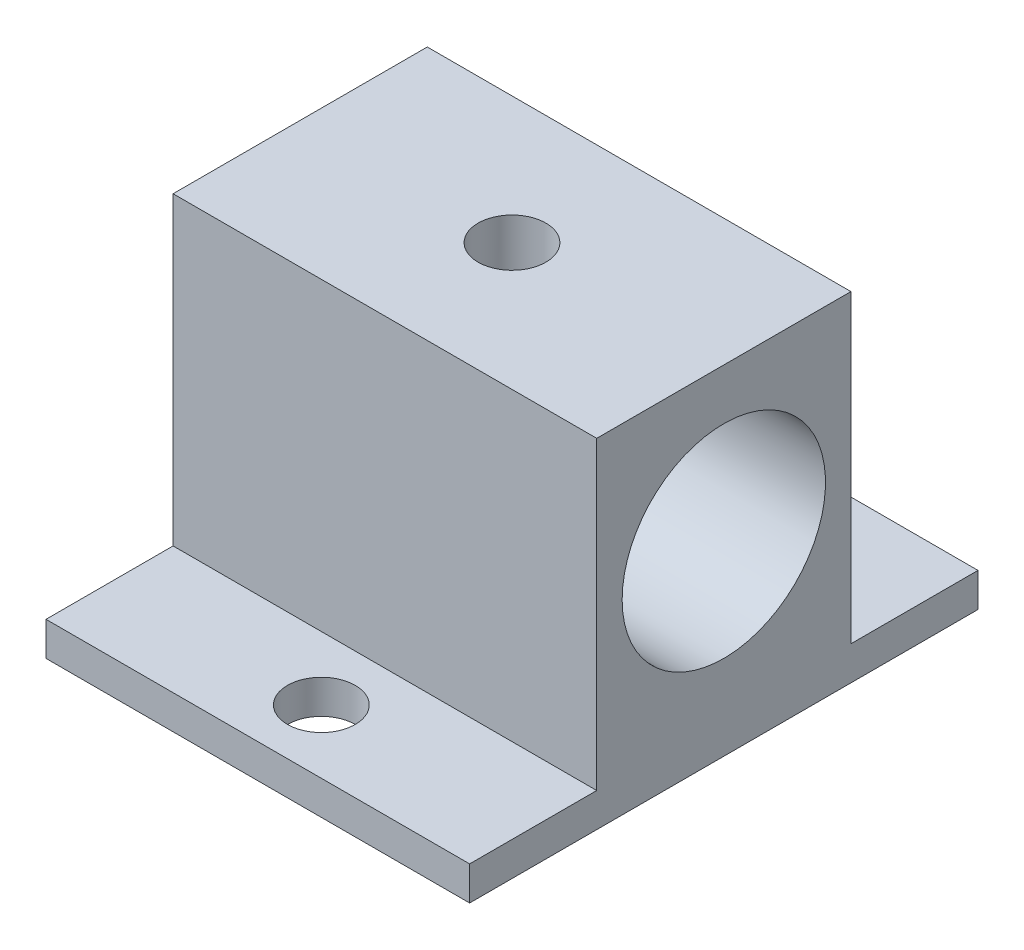
ISO-10303-21;
HEADER;
FILE_DESCRIPTION(('STEP AP214'),'2;1');
FILE_NAME('part.step','',(''),(''),'','','');
FILE_SCHEMA(('AUTOMOTIVE_DESIGN { 1 0 10303 214 1 1 1 1 }'));
ENDSEC;
DATA;
#1=APPLICATION_CONTEXT('core data for automotive mechanical design processes');
#2=APPLICATION_PROTOCOL_DEFINITION('international standard','automotive_design',2000,#1);
#3=PRODUCT_CONTEXT('',#1,'mechanical');
#4=PRODUCT('Part','Part','',(#3));
#5=PRODUCT_RELATED_PRODUCT_CATEGORY('part','',(#4));
#6=PRODUCT_DEFINITION_FORMATION('','',#4);
#7=PRODUCT_DEFINITION_CONTEXT('part definition',#1,'design');
#8=PRODUCT_DEFINITION('design','',#6,#7);
#9=PRODUCT_DEFINITION_SHAPE('','',#8);
#10=(LENGTH_UNIT() NAMED_UNIT(*) SI_UNIT(.MILLI.,.METRE.));
#11=(NAMED_UNIT(*) PLANE_ANGLE_UNIT() SI_UNIT($,.RADIAN.));
#12=(NAMED_UNIT(*) SI_UNIT($,.STERADIAN.) SOLID_ANGLE_UNIT());
#13=UNCERTAINTY_MEASURE_WITH_UNIT(LENGTH_MEASURE(1.E-05),#10,'distance_accuracy_value','');
#14=(GEOMETRIC_REPRESENTATION_CONTEXT(3) GLOBAL_UNCERTAINTY_ASSIGNED_CONTEXT((#13)) GLOBAL_UNIT_ASSIGNED_CONTEXT((#10,
#11,#12)) REPRESENTATION_CONTEXT('',''));
#15=CARTESIAN_POINT('',(0.,0.,0.));
#16=DIRECTION('',(0.,0.,1.));
#17=DIRECTION('',(1.,0.,0.));
#18=AXIS2_PLACEMENT_3D('',#15,#16,#17);
#19=CARTESIAN_POINT('',(0.,2.,0.));
#20=DIRECTION('',(0.,-1.,0.));
#21=DIRECTION('',(0.,0.,-1.));
#22=AXIS2_PLACEMENT_3D('',#19,#20,#21);
#23=PLANE('',#22);
#24=CARTESIAN_POINT('',(0.,2.,11.25));
#25=DIRECTION('',(0.,1.,0.));
#26=DIRECTION('',(0.,0.,-1.));
#27=AXIS2_PLACEMENT_3D('',#24,#25,#26);
#28=CIRCLE('',#27,2.);
#29=CARTESIAN_POINT('',(0.,2.,9.25));
#30=VERTEX_POINT('',#29);
#31=EDGE_CURVE('E210',#30,#30,#28,.T.);
#32=ORIENTED_EDGE('',*,*,#31,.F.);
#33=EDGE_LOOP('',(#32));
#34=FACE_BOUND('',#33,.T.);
#35=DIRECTION('',(1.,0.,0.));
#36=VECTOR('',#35,1.);
#37=CARTESIAN_POINT('',(-12.5,2.,7.5));
#38=LINE('',#37,#36);
#39=CARTESIAN_POINT('',(-12.5,2.,7.5));
#40=VERTEX_POINT('',#39);
#41=CARTESIAN_POINT('',(12.5,2.,7.5));
#42=VERTEX_POINT('',#41);
#43=EDGE_CURVE('E53',#40,#42,#38,.T.);
#44=ORIENTED_EDGE('',*,*,#43,.F.);
#45=DIRECTION('',(0.,0.,1.));
#46=VECTOR('',#45,1.);
#47=CARTESIAN_POINT('',(-12.5,2.,15.));
#48=LINE('',#47,#46);
#49=CARTESIAN_POINT('',(-12.5,2.,15.));
#50=VERTEX_POINT('',#49);
#51=EDGE_CURVE('E174',#40,#50,#48,.T.);
#52=ORIENTED_EDGE('',*,*,#51,.T.);
#53=DIRECTION('',(1.,0.,0.));
#54=VECTOR('',#53,1.);
#55=CARTESIAN_POINT('',(-12.5,2.,15.));
#56=LINE('',#55,#54);
#57=CARTESIAN_POINT('',(12.5,2.,15.));
#58=VERTEX_POINT('',#57);
#59=EDGE_CURVE('E164',#50,#58,#56,.T.);
#60=ORIENTED_EDGE('',*,*,#59,.T.);
#61=DIRECTION('',(0.,0.,-1.));
#62=VECTOR('',#61,1.);
#63=CARTESIAN_POINT('',(12.5,2.,15.));
#64=LINE('',#63,#62);
#65=EDGE_CURVE('E154',#58,#42,#64,.T.);
#66=ORIENTED_EDGE('',*,*,#65,.T.);
#67=EDGE_LOOP('',(#44,#52,#60,#66));
#68=FACE_BOUND('',#67,.T.);
#69=ADVANCED_FACE('F32',(#34,#68),#23,.F.);
#70=CARTESIAN_POINT('',(0.,2.,-11.25));
#71=DIRECTION('',(0.,1.,0.));
#72=DIRECTION('',(0.,0.,1.));
#73=AXIS2_PLACEMENT_3D('',#70,#71,#72);
#74=CIRCLE('',#73,1.99999999999999);
#75=CARTESIAN_POINT('',(0.,2.,-9.25000000000001));
#76=VERTEX_POINT('',#75);
#77=EDGE_CURVE('E204',#76,#76,#74,.T.);
#78=ORIENTED_EDGE('',*,*,#77,.F.);
#79=EDGE_LOOP('',(#78));
#80=FACE_BOUND('',#79,.T.);
#81=DIRECTION('',(-1.,0.,0.));
#82=VECTOR('',#81,1.);
#83=CARTESIAN_POINT('',(-12.5,2.,-7.5));
#84=LINE('',#83,#82);
#85=CARTESIAN_POINT('',(12.5,2.,-7.5));
#86=VERTEX_POINT('',#85);
#87=CARTESIAN_POINT('',(-12.5,2.,-7.5));
#88=VERTEX_POINT('',#87);
#89=EDGE_CURVE('E61',#86,#88,#84,.T.);
#90=ORIENTED_EDGE('',*,*,#89,.F.);
#91=CARTESIAN_POINT('',(12.5,2.,-15.));
#92=VERTEX_POINT('',#91);
#93=EDGE_CURVE('E125',#86,#92,#64,.T.);
#94=ORIENTED_EDGE('',*,*,#93,.T.);
#95=DIRECTION('',(-1.,0.,0.));
#96=VECTOR('',#95,1.);
#97=CARTESIAN_POINT('',(-12.5,2.,-15.));
#98=LINE('',#97,#96);
#99=CARTESIAN_POINT('',(-12.5,2.,-15.));
#100=VERTEX_POINT('',#99);
#101=EDGE_CURVE('E148',#92,#100,#98,.T.);
#102=ORIENTED_EDGE('',*,*,#101,.T.);
#103=EDGE_CURVE('E170',#100,#88,#48,.T.);
#104=ORIENTED_EDGE('',*,*,#103,.T.);
#105=EDGE_LOOP('',(#90,#94,#102,#104));
#106=FACE_BOUND('',#105,.T.);
#107=ADVANCED_FACE('F180',(#80,#106),#23,.F.);
#108=CARTESIAN_POINT('',(12.5,2.,15.));
#109=DIRECTION('',(-1.,0.,0.));
#110=DIRECTION('',(0.,0.,1.));
#111=AXIS2_PLACEMENT_3D('',#108,#109,#110);
#112=PLANE('',#111);
#113=CARTESIAN_POINT('',(12.5,11.,0.));
#114=DIRECTION('',(-1.,0.,0.));
#115=DIRECTION('',(0.,0.,1.));
#116=AXIS2_PLACEMENT_3D('',#113,#114,#115);
#117=CIRCLE('',#116,6.);
#118=CARTESIAN_POINT('',(12.5,11.,6.));
#119=VERTEX_POINT('',#118);
#120=EDGE_CURVE('E190',#119,#119,#117,.T.);
#121=ORIENTED_EDGE('',*,*,#120,.T.);
#122=EDGE_LOOP('',(#121));
#123=FACE_BOUND('',#122,.T.);
#124=DIRECTION('',(0.,0.,-1.));
#125=VECTOR('',#124,1.);
#126=CARTESIAN_POINT('',(12.5,0.,15.));
#127=LINE('',#126,#125);
#128=CARTESIAN_POINT('',(12.5,0.,15.));
#129=VERTEX_POINT('',#128);
#130=CARTESIAN_POINT('',(12.5,0.,-15.));
#131=VERTEX_POINT('',#130);
#132=EDGE_CURVE('E126',#129,#131,#127,.T.);
#133=ORIENTED_EDGE('',*,*,#132,.T.);
#134=DIRECTION('',(0.,-1.,0.));
#135=VECTOR('',#134,1.);
#136=CARTESIAN_POINT('',(12.5,2.,-15.));
#137=LINE('',#136,#135);
#138=EDGE_CURVE('E11',#92,#131,#137,.T.);
#139=ORIENTED_EDGE('',*,*,#138,.F.);
#140=ORIENTED_EDGE('',*,*,#93,.F.);
#141=DIRECTION('',(0.,-1.,0.));
#142=VECTOR('',#141,1.);
#143=CARTESIAN_POINT('',(12.5,20.,-7.5));
#144=LINE('',#143,#142);
#145=CARTESIAN_POINT('',(12.5,20.,-7.5));
#146=VERTEX_POINT('',#145);
#147=EDGE_CURVE('E107',#146,#86,#144,.T.);
#148=ORIENTED_EDGE('',*,*,#147,.F.);
#149=DIRECTION('',(0.,0.,-1.));
#150=VECTOR('',#149,1.);
#151=CARTESIAN_POINT('',(12.5,20.,-7.5));
#152=LINE('',#151,#150);
#153=CARTESIAN_POINT('',(12.5,20.,7.5));
#154=VERTEX_POINT('',#153);
#155=EDGE_CURVE('E113',#154,#146,#152,.T.);
#156=ORIENTED_EDGE('',*,*,#155,.F.);
#157=DIRECTION('',(0.,-1.,0.));
#158=VECTOR('',#157,1.);
#159=CARTESIAN_POINT('',(12.5,20.,7.5));
#160=LINE('',#159,#158);
#161=EDGE_CURVE('E139',#154,#42,#160,.T.);
#162=ORIENTED_EDGE('',*,*,#161,.T.);
#163=ORIENTED_EDGE('',*,*,#65,.F.);
#164=DIRECTION('',(0.,-1.,0.));
#165=VECTOR('',#164,1.);
#166=CARTESIAN_POINT('',(12.5,2.,15.));
#167=LINE('',#166,#165);
#168=EDGE_CURVE('E161',#58,#129,#167,.T.);
#169=ORIENTED_EDGE('',*,*,#168,.T.);
#170=EDGE_LOOP('',(#133,#139,#140,#148,#156,#162,#163,#169));
#171=FACE_BOUND('',#170,.T.);
#172=ADVANCED_FACE('F34',(#123,#171),#112,.F.);
#173=CARTESIAN_POINT('',(-12.5,2.,-15.));
#174=DIRECTION('',(0.,0.,1.));
#175=DIRECTION('',(1.,0.,0.));
#176=AXIS2_PLACEMENT_3D('',#173,#174,#175);
#177=PLANE('',#176);
#178=DIRECTION('',(-1.,0.,0.));
#179=VECTOR('',#178,1.);
#180=CARTESIAN_POINT('',(-12.5,0.,-15.));
#181=LINE('',#180,#179);
#182=CARTESIAN_POINT('',(-12.5,0.,-15.));
#183=VERTEX_POINT('',#182);
#184=EDGE_CURVE('E128',#131,#183,#181,.T.);
#185=ORIENTED_EDGE('',*,*,#184,.T.);
#186=DIRECTION('',(0.,-1.,0.));
#187=VECTOR('',#186,1.);
#188=CARTESIAN_POINT('',(-12.5,2.,-15.));
#189=LINE('',#188,#187);
#190=EDGE_CURVE('E45',#100,#183,#189,.T.);
#191=ORIENTED_EDGE('',*,*,#190,.F.);
#192=ORIENTED_EDGE('',*,*,#101,.F.);
#193=ORIENTED_EDGE('',*,*,#138,.T.);
#194=EDGE_LOOP('',(#185,#191,#192,#193));
#195=FACE_BOUND('',#194,.T.);
#196=ADVANCED_FACE('F182',(#195),#177,.F.);
#197=CARTESIAN_POINT('',(-12.5,2.,15.));
#198=DIRECTION('',(1.,0.,0.));
#199=DIRECTION('',(0.,0.,-1.));
#200=AXIS2_PLACEMENT_3D('',#197,#198,#199);
#201=PLANE('',#200);
#202=CARTESIAN_POINT('',(-12.5,11.,0.));
#203=DIRECTION('',(-1.,0.,0.));
#204=DIRECTION('',(0.,0.,1.));
#205=AXIS2_PLACEMENT_3D('',#202,#203,#204);
#206=CIRCLE('',#205,6.);
#207=CARTESIAN_POINT('',(-12.5,11.,6.));
#208=VERTEX_POINT('',#207);
#209=EDGE_CURVE('E193',#208,#208,#206,.T.);
#210=ORIENTED_EDGE('',*,*,#209,.F.);
#211=EDGE_LOOP('',(#210));
#212=FACE_BOUND('',#211,.T.);
#213=DIRECTION('',(0.,0.,1.));
#214=VECTOR('',#213,1.);
#215=CARTESIAN_POINT('',(-12.5,0.,15.));
#216=LINE('',#215,#214);
#217=CARTESIAN_POINT('',(-12.5,0.,15.));
#218=VERTEX_POINT('',#217);
#219=EDGE_CURVE('E167',#183,#218,#216,.T.);
#220=ORIENTED_EDGE('',*,*,#219,.T.);
#221=DIRECTION('',(0.,-1.,0.));
#222=VECTOR('',#221,1.);
#223=CARTESIAN_POINT('',(-12.5,2.,15.));
#224=LINE('',#223,#222);
#225=EDGE_CURVE('E158',#50,#218,#224,.T.);
#226=ORIENTED_EDGE('',*,*,#225,.F.);
#227=ORIENTED_EDGE('',*,*,#51,.F.);
#228=DIRECTION('',(0.,-1.,0.));
#229=VECTOR('',#228,1.);
#230=CARTESIAN_POINT('',(-12.5,20.,7.5));
#231=LINE('',#230,#229);
#232=CARTESIAN_POINT('',(-12.5,20.,7.5));
#233=VERTEX_POINT('',#232);
#234=EDGE_CURVE('E130',#233,#40,#231,.T.);
#235=ORIENTED_EDGE('',*,*,#234,.F.);
#236=DIRECTION('',(0.,0.,1.));
#237=VECTOR('',#236,1.);
#238=CARTESIAN_POINT('',(-12.5,20.,-7.5));
#239=LINE('',#238,#237);
#240=CARTESIAN_POINT('',(-12.5,20.,-7.5));
#241=VERTEX_POINT('',#240);
#242=EDGE_CURVE('E112',#241,#233,#239,.T.);
#243=ORIENTED_EDGE('',*,*,#242,.F.);
#244=DIRECTION('',(0.,-1.,0.));
#245=VECTOR('',#244,1.);
#246=CARTESIAN_POINT('',(-12.5,20.,-7.5));
#247=LINE('',#246,#245);
#248=EDGE_CURVE('E109',#241,#88,#247,.T.);
#249=ORIENTED_EDGE('',*,*,#248,.T.);
#250=ORIENTED_EDGE('',*,*,#103,.F.);
#251=ORIENTED_EDGE('',*,*,#190,.T.);
#252=EDGE_LOOP('',(#220,#226,#227,#235,#243,#249,#250,#251));
#253=FACE_BOUND('',#252,.T.);
#254=ADVANCED_FACE('F185',(#212,#253),#201,.F.);
#255=CARTESIAN_POINT('',(-12.5,2.,15.));
#256=DIRECTION('',(0.,0.,-1.));
#257=DIRECTION('',(-1.,0.,0.));
#258=AXIS2_PLACEMENT_3D('',#255,#256,#257);
#259=PLANE('',#258);
#260=DIRECTION('',(1.,0.,0.));
#261=VECTOR('',#260,1.);
#262=CARTESIAN_POINT('',(-12.5,0.,15.));
#263=LINE('',#262,#261);
#264=EDGE_CURVE('E165',#218,#129,#263,.T.);
#265=ORIENTED_EDGE('',*,*,#264,.T.);
#266=ORIENTED_EDGE('',*,*,#168,.F.);
#267=ORIENTED_EDGE('',*,*,#59,.F.);
#268=ORIENTED_EDGE('',*,*,#225,.T.);
#269=EDGE_LOOP('',(#265,#266,#267,#268));
#270=FACE_BOUND('',#269,.T.);
#271=ADVANCED_FACE('F237',(#270),#259,.F.);
#272=CARTESIAN_POINT('',(0.,0.,0.));
#273=DIRECTION('',(0.,-1.,0.));
#274=DIRECTION('',(0.,0.,-1.));
#275=AXIS2_PLACEMENT_3D('',#272,#273,#274);
#276=PLANE('',#275);
#277=CARTESIAN_POINT('',(0.,0.,11.25));
#278=DIRECTION('',(0.,1.,0.));
#279=DIRECTION('',(0.,0.,-1.));
#280=AXIS2_PLACEMENT_3D('',#277,#278,#279);
#281=CIRCLE('',#280,2.);
#282=CARTESIAN_POINT('',(0.,0.,9.25));
#283=VERTEX_POINT('',#282);
#284=EDGE_CURVE('E207',#283,#283,#281,.T.);
#285=ORIENTED_EDGE('',*,*,#284,.T.);
#286=EDGE_LOOP('',(#285));
#287=FACE_BOUND('',#286,.T.);
#288=CARTESIAN_POINT('',(0.,0.,-11.25));
#289=DIRECTION('',(0.,1.,0.));
#290=DIRECTION('',(0.,0.,1.));
#291=AXIS2_PLACEMENT_3D('',#288,#289,#290);
#292=CIRCLE('',#291,1.99999999999999);
#293=CARTESIAN_POINT('',(0.,0.,-9.25000000000001));
#294=VERTEX_POINT('',#293);
#295=EDGE_CURVE('E200',#294,#294,#292,.T.);
#296=ORIENTED_EDGE('',*,*,#295,.T.);
#297=EDGE_LOOP('',(#296));
#298=FACE_BOUND('',#297,.T.);
#299=CARTESIAN_POINT('',(0.,0.,0.));
#300=DIRECTION('',(0.,1.,0.));
#301=DIRECTION('',(0.,0.,1.));
#302=AXIS2_PLACEMENT_3D('',#299,#300,#301);
#303=CIRCLE('',#302,2.);
#304=CARTESIAN_POINT('',(0.,0.,2.));
#305=VERTEX_POINT('',#304);
#306=EDGE_CURVE('E199',#305,#305,#303,.T.);
#307=ORIENTED_EDGE('',*,*,#306,.T.);
#308=EDGE_LOOP('',(#307));
#309=FACE_BOUND('',#308,.T.);
#310=ORIENTED_EDGE('',*,*,#132,.F.);
#311=ORIENTED_EDGE('',*,*,#264,.F.);
#312=ORIENTED_EDGE('',*,*,#219,.F.);
#313=ORIENTED_EDGE('',*,*,#184,.F.);
#314=EDGE_LOOP('',(#310,#311,#312,#313));
#315=FACE_BOUND('',#314,.T.);
#316=ADVANCED_FACE('F216',(#287,#298,#309,#315),#276,.T.);
#317=CARTESIAN_POINT('',(-12.5,20.,-7.5));
#318=DIRECTION('',(0.,0.,1.));
#319=DIRECTION('',(1.,0.,0.));
#320=AXIS2_PLACEMENT_3D('',#317,#318,#319);
#321=PLANE('',#320);
#322=ORIENTED_EDGE('',*,*,#89,.T.);
#323=ORIENTED_EDGE('',*,*,#248,.F.);
#324=DIRECTION('',(-1.,0.,0.));
#325=VECTOR('',#324,1.);
#326=CARTESIAN_POINT('',(-12.5,20.,-7.5));
#327=LINE('',#326,#325);
#328=EDGE_CURVE('E103',#146,#241,#327,.T.);
#329=ORIENTED_EDGE('',*,*,#328,.F.);
#330=ORIENTED_EDGE('',*,*,#147,.T.);
#331=EDGE_LOOP('',(#322,#323,#329,#330));
#332=FACE_BOUND('',#331,.T.);
#333=ADVANCED_FACE('F105',(#332),#321,.F.);
#334=CARTESIAN_POINT('',(-12.5,20.,7.5));
#335=DIRECTION('',(0.,0.,-1.));
#336=DIRECTION('',(-1.,0.,0.));
#337=AXIS2_PLACEMENT_3D('',#334,#335,#336);
#338=PLANE('',#337);
#339=ORIENTED_EDGE('',*,*,#43,.T.);
#340=ORIENTED_EDGE('',*,*,#161,.F.);
#341=DIRECTION('',(1.,0.,0.));
#342=VECTOR('',#341,1.);
#343=CARTESIAN_POINT('',(-12.5,20.,7.5));
#344=LINE('',#343,#342);
#345=EDGE_CURVE('E118',#233,#154,#344,.T.);
#346=ORIENTED_EDGE('',*,*,#345,.F.);
#347=ORIENTED_EDGE('',*,*,#234,.T.);
#348=EDGE_LOOP('',(#339,#340,#346,#347));
#349=FACE_BOUND('',#348,.T.);
#350=ADVANCED_FACE('F262',(#349),#338,.F.);
#351=CARTESIAN_POINT('',(0.,20.,0.));
#352=DIRECTION('',(0.,1.,0.));
#353=DIRECTION('',(0.,0.,1.));
#354=AXIS2_PLACEMENT_3D('',#351,#352,#353);
#355=PLANE('',#354);
#356=CARTESIAN_POINT('',(0.,20.,0.));
#357=DIRECTION('',(0.,1.,0.));
#358=DIRECTION('',(0.,0.,1.));
#359=AXIS2_PLACEMENT_3D('',#356,#357,#358);
#360=CIRCLE('',#359,2.);
#361=CARTESIAN_POINT('',(0.,20.,2.));
#362=VERTEX_POINT('',#361);
#363=EDGE_CURVE('E196',#362,#362,#360,.T.);
#364=ORIENTED_EDGE('',*,*,#363,.F.);
#365=EDGE_LOOP('',(#364));
#366=FACE_BOUND('',#365,.T.);
#367=ORIENTED_EDGE('',*,*,#155,.T.);
#368=ORIENTED_EDGE('',*,*,#328,.T.);
#369=ORIENTED_EDGE('',*,*,#242,.T.);
#370=ORIENTED_EDGE('',*,*,#345,.T.);
#371=EDGE_LOOP('',(#367,#368,#369,#370));
#372=FACE_BOUND('',#371,.T.);
#373=ADVANCED_FACE('F116',(#366,#372),#355,.T.);
#374=CARTESIAN_POINT('',(12.50005,11.,0.));
#375=DIRECTION('',(-1.,0.,0.));
#376=DIRECTION('',(0.,0.,1.));
#377=AXIS2_PLACEMENT_3D('',#374,#375,#376);
#378=CYLINDRICAL_SURFACE('',#377,6.);
#379=CARTESIAN_POINT('',(0.,5.34314575050762,2.));
#380=CARTESIAN_POINT('',(-0.108936349672144,5.34314610939132,2.00000051589543));
#381=CARTESIAN_POINT('',(-0.217869599647185,5.33996461418285,1.99106956737104));
#382=CARTESIAN_POINT('',(-0.432508841988498,5.3276485183749,1.95570226337762));
#383=CARTESIAN_POINT('',(-0.538214299744939,5.31851293715622,1.92926302433679));
#384=CARTESIAN_POINT('',(-0.743253785994576,5.29543592622417,1.85991097136981));
#385=CARTESIAN_POINT('',(-0.842599858885433,5.28150392057356,1.81703044280649));
#386=CARTESIAN_POINT('',(-1.03272009709592,5.25041755979351,1.71612325688276));
#387=CARTESIAN_POINT('',(-1.12349236510726,5.23326249392775,1.65809325772037));
#388=CARTESIAN_POINT('',(-1.29743992467663,5.19691021185054,1.52610229288576));
#389=CARTESIAN_POINT('',(-1.38023085734346,5.17766210310712,1.45164868275584));
#390=CARTESIAN_POINT('',(-1.53241360244928,5.13972270397994,1.28997533442879));
#391=CARTESIAN_POINT('',(-1.60180326316474,5.12103150342077,1.20275355010475));
#392=CARTESIAN_POINT('',(-1.72695779465919,5.08572266156402,1.01520901593002));
#393=CARTESIAN_POINT('',(-1.78231994123592,5.06917184596789,0.91460382244905));
#394=CARTESIAN_POINT('',(-1.87518317025502,5.04060826458034,0.704862445974948));
#395=CARTESIAN_POINT('',(-1.91268906635381,5.02859427593996,0.595728571374424));
#396=CARTESIAN_POINT('',(-1.96747170926479,5.01081849136187,0.376057634866989));
#397=CARTESIAN_POINT('',(-1.98540689251401,5.00485370444882,0.265701509705937));
#398=CARTESIAN_POINT('',(-2.00263258672132,4.99912783563504,0.043395749648179));
#399=CARTESIAN_POINT('',(-2.00192790330482,4.99936515474209,-0.0685534670877926));
#400=CARTESIAN_POINT('',(-1.98231149086794,5.00587920762537,-0.286207030387629));
#401=CARTESIAN_POINT('',(-1.96411494305102,5.01191870489765,-0.391984097183313));
#402=CARTESIAN_POINT('',(-1.91121403803905,5.02906065320537,-0.598886877644343));
#403=CARTESIAN_POINT('',(-1.87650856204035,5.04016344737636,-0.700012275558432));
#404=CARTESIAN_POINT('',(-1.79115736538788,5.06648659413551,-0.896304949683946));
#405=CARTESIAN_POINT('',(-1.74030812290698,5.08175914951969,-0.99137644193769));
#406=CARTESIAN_POINT('',(-1.62428058910269,5.11483213922162,-1.17184865105464));
#407=CARTESIAN_POINT('',(-1.55909831334474,5.13263327597066,-1.25724666877068));
#408=CARTESIAN_POINT('',(-1.4126512130806,5.16987616300207,-1.42020173310262));
#409=CARTESIAN_POINT('',(-1.33077368431704,5.18935569662245,-1.49720031413054));
#410=CARTESIAN_POINT('',(-1.15510254854676,5.22705329502199,-1.63655451919635));
#411=CARTESIAN_POINT('',(-1.06130710854391,5.24527116508769,-1.69890788656309));
#412=CARTESIAN_POINT('',(-0.862692748793121,5.27858949757775,-1.80797491007149));
#413=CARTESIAN_POINT('',(-0.757735737364453,5.29364181430504,-1.85445292724268));
#414=CARTESIAN_POINT('',(-0.540857211571165,5.31836698351231,-1.92888638653867));
#415=CARTESIAN_POINT('',(-0.428938637587509,5.32804209025815,-1.95684959149499));
#416=CARTESIAN_POINT('',(-0.206723289176851,5.3404072736883,-1.99232256419504));
#417=CARTESIAN_POINT('',(-0.096581150502688,5.34339279362488,-2.00069819101527));
#418=CARTESIAN_POINT('',(0.123552298228213,5.34286655881631,-1.99921087781944));
#419=CARTESIAN_POINT('',(0.233543632047977,5.33935598416371,-1.98935125045353));
#420=CARTESIAN_POINT('',(0.446313931423819,5.32652763819401,-1.95245130310462));
#421=CARTESIAN_POINT('',(0.549210860301682,5.31741349118319,-1.92601278796137));
#422=CARTESIAN_POINT('',(0.749087212478369,5.29462892657954,-1.85742772512093));
#423=CARTESIAN_POINT('',(0.84606558318156,5.28095770130321,-1.81527839272684));
#424=CARTESIAN_POINT('',(1.034760841694,5.25006244808426,-1.71494868147787));
#425=CARTESIAN_POINT('',(1.1262132852836,5.23273948668743,-1.65630223671699));
#426=CARTESIAN_POINT('',(1.29829210476744,5.1966846253807,-1.52517126111512));
#427=CARTESIAN_POINT('',(1.37891527732244,5.17795231112411,-1.45268265099756));
#428=CARTESIAN_POINT('',(1.53105596818128,5.14009922724302,-1.29178341180065));
#429=CARTESIAN_POINT('',(1.6019487800377,5.12100312844207,-1.2027745410933));
#430=CARTESIAN_POINT('',(1.72783228469609,5.08546296773782,-1.01365458280051));
#431=CARTESIAN_POINT('',(1.78282354232485,5.0690188116461,-0.913543889729105));
#432=CARTESIAN_POINT('',(1.87484020972343,5.04071188378794,-0.705559724864592));
#433=CARTESIAN_POINT('',(1.91198255429613,5.02881939990938,-0.597742246642394));
#434=CARTESIAN_POINT('',(1.96745548412021,5.01082778324451,-0.376916931692033));
#435=CARTESIAN_POINT('',(1.98579285976101,5.00472655931962,-0.263910983907779));
#436=CARTESIAN_POINT('',(2.00252415521128,4.99916273527487,-0.0416306717200817));
#437=CARTESIAN_POINT('',(2.00181490786475,4.99940159821122,0.0675694478400373));
#438=CARTESIAN_POINT('',(1.98268538370718,5.00575606961204,0.284222290000348));
#439=CARTESIAN_POINT('',(1.96426654369446,5.01187120132848,0.391675153638114));
#440=CARTESIAN_POINT('',(1.91083553084807,5.02918170091175,0.600084238864117));
#441=CARTESIAN_POINT('',(1.87609156929413,5.04029483277703,0.701116541825578));
#442=CARTESIAN_POINT('',(1.79124493780569,5.0664567859101,0.895956701879591));
#443=CARTESIAN_POINT('',(1.74113948960597,5.08150631903967,0.989763248284864));
#444=CARTESIAN_POINT('',(1.62486097579599,5.11468262344238,1.17126803261757));
#445=CARTESIAN_POINT('',(1.55816262923672,5.13290255016147,1.25861250311521));
#446=CARTESIAN_POINT('',(1.41148521768761,5.17014022416241,1.42116205254485));
#447=CARTESIAN_POINT('',(1.33150191547455,5.18915822453806,1.49636324324918));
#448=CARTESIAN_POINT('',(1.1567812888261,5.22673440348804,1.63548361766624));
#449=CARTESIAN_POINT('',(1.06158897804672,5.24524544022739,1.6988459319958));
#450=CARTESIAN_POINT('',(0.86133114619444,5.27879613353969,1.80862868660223));
#451=CARTESIAN_POINT('',(0.75626821394067,5.29383669677502,1.85505355363895));
#452=CARTESIAN_POINT('',(0.544076351968735,5.31797331586971,1.92768765640833));
#453=CARTESIAN_POINT('',(0.437255472949268,5.32730734285636,1.95471581829904));
#454=CARTESIAN_POINT('',(0.220287899066597,5.33989232920964,1.99086864029853));
#455=CARTESIAN_POINT('',(0.110142365178582,5.34314538765078,1.99999947839318));
#456=CARTESIAN_POINT('',(0.,5.34314575050762,2.));
#457=B_SPLINE_CURVE_WITH_KNOTS('',3,(#379,#380,#381,#382,#383,#384,#385,#386,#387,#388,#389,
#390,#391,#392,#393,#394,#395,#396,#397,#398,#399,#400,#401,#402,#403,#404,#405,#406,#407,#408,
#409,#410,#411,#412,#413,#414,#415,#416,#417,#418,#419,#420,#421,#422,#423,#424,#425,#426,#427,
#428,#429,#430,#431,#432,#433,#434,#435,#436,#437,#438,#439,#440,#441,#442,#443,#444,#445,#446,
#447,#448,#449,#450,#451,#452,#453,#454,#455,#456),.UNSPECIFIED.,.T.,.F.,(4,2,2,2,2,2,2,2,2,2,2,
2,2,2,2,2,2,2,2,2,2,2,2,2,2,2,2,2,2,2,2,2,2,2,2,2,2,2,4),(0.,0.326401169598712,
0.652856110030327,0.978673255001655,1.30456233237088,1.64202674855136,1.97954530343976,
2.32587012287314,2.67210152773578,3.00628637529868,3.34038506604655,3.66138009651138,
3.98239688378473,4.3076330972067,4.63295983748044,4.97360348727835,5.31429959224212,
5.65985279686111,6.00526102713231,6.33508582728879,6.66485071674468,6.98328791537552,
7.30178158293892,7.6303771547143,7.95906971324255,8.30357616342185,8.64807037515065,
8.99027582381703,9.33235766008313,9.65836169355271,9.98433928019562,10.3051391208086,
10.6259970152649,10.9587103904127,11.2915300886526,11.6373780547229,11.9831355653373,
12.3132642432538,12.6432789438093),.UNSPECIFIED.);
#458=CARTESIAN_POINT('',(0.,5.34314575050762,2.));
#459=VERTEX_POINT('',#458);
#460=EDGE_CURVE('E36',#459,#459,#457,.T.);
#461=ORIENTED_EDGE('',*,*,#460,.T.);
#462=EDGE_LOOP('',(#461));
#463=FACE_BOUND('',#462,.T.);
#464=CARTESIAN_POINT('',(0.,16.6568542494924,2.));
#465=CARTESIAN_POINT('',(0.108936349672144,16.6568538906087,2.00000051589543));
#466=CARTESIAN_POINT('',(0.217869599647186,16.6600353858171,1.99106956737104));
#467=CARTESIAN_POINT('',(0.432508841988498,16.6723514816251,1.95570226337762));
#468=CARTESIAN_POINT('',(0.538214299744939,16.6814870628438,1.92926302433679));
#469=CARTESIAN_POINT('',(0.743253785994576,16.7045640737758,1.85991097136981));
#470=CARTESIAN_POINT('',(0.842599858885433,16.7184960794264,1.81703044280649));
#471=CARTESIAN_POINT('',(1.03272009709592,16.7495824402065,1.71612325688276));
#472=CARTESIAN_POINT('',(1.12349236510726,16.7667375060722,1.65809325772037));
#473=CARTESIAN_POINT('',(1.29743992467663,16.8030897881495,1.52610229288576));
#474=CARTESIAN_POINT('',(1.38023085734346,16.8223378968929,1.45164868275584));
#475=CARTESIAN_POINT('',(1.53241360244928,16.8602772960201,1.28997533442879));
#476=CARTESIAN_POINT('',(1.60180326316474,16.8789684965792,1.20275355010475));
#477=CARTESIAN_POINT('',(1.72695779465919,16.914277338436,1.01520901593002));
#478=CARTESIAN_POINT('',(1.78231994123592,16.9308281540321,0.914603822449051));
#479=CARTESIAN_POINT('',(1.87518317025502,16.9593917354197,0.704862445974948));
#480=CARTESIAN_POINT('',(1.91268906635381,16.97140572406,0.595728571374423));
#481=CARTESIAN_POINT('',(1.96747170926479,16.9891815086381,0.376057634866988));
#482=CARTESIAN_POINT('',(1.98540689251401,16.9951462955512,0.265701509705936));
#483=CARTESIAN_POINT('',(2.00263258672132,17.000872164365,0.0433957496481784));
#484=CARTESIAN_POINT('',(2.00192790330482,17.0006348452579,-0.0685534670877932));
#485=CARTESIAN_POINT('',(1.98231149086794,16.9941207923746,-0.28620703038763));
#486=CARTESIAN_POINT('',(1.96411494305102,16.9880812951023,-0.391984097183314));
#487=CARTESIAN_POINT('',(1.91121403803905,16.9709393467946,-0.598886877644344));
#488=CARTESIAN_POINT('',(1.87650856204035,16.9598365526236,-0.700012275558432));
#489=CARTESIAN_POINT('',(1.79115736538788,16.9335134058645,-0.896304949683946));
#490=CARTESIAN_POINT('',(1.74030812290698,16.9182408504803,-0.99137644193769));
#491=CARTESIAN_POINT('',(1.62428058910269,16.8851678607784,-1.17184865105464));
#492=CARTESIAN_POINT('',(1.55909831334474,16.8673667240293,-1.25724666877068));
#493=CARTESIAN_POINT('',(1.4126512130806,16.8301238369979,-1.42020173310262));
#494=CARTESIAN_POINT('',(1.33077368431704,16.8106443033776,-1.49720031413054));
#495=CARTESIAN_POINT('',(1.15510254854676,16.772946704978,-1.63655451919635));
#496=CARTESIAN_POINT('',(1.06130710854391,16.7547288349123,-1.69890788656309));
#497=CARTESIAN_POINT('',(0.86269274879312,16.7214105024222,-1.80797491007149));
#498=CARTESIAN_POINT('',(0.757735737364452,16.706358185695,-1.85445292724268));
#499=CARTESIAN_POINT('',(0.540857211571165,16.6816330164877,-1.92888638653867));
#500=CARTESIAN_POINT('',(0.428938637587509,16.6719579097419,-1.95684959149499));
#501=CARTESIAN_POINT('',(0.206723289176851,16.6595927263117,-1.99232256419504));
#502=CARTESIAN_POINT('',(0.096581150502688,16.6566072063751,-2.00069819101527));
#503=CARTESIAN_POINT('',(-0.123552298228213,16.6571334411837,-1.99921087781944));
#504=CARTESIAN_POINT('',(-0.233543632047977,16.6606440158363,-1.98935125045353));
#505=CARTESIAN_POINT('',(-0.446313931423818,16.673472361806,-1.95245130310462));
#506=CARTESIAN_POINT('',(-0.549210860301682,16.6825865088168,-1.92601278796137));
#507=CARTESIAN_POINT('',(-0.749087212478368,16.7053710734205,-1.85742772512093));
#508=CARTESIAN_POINT('',(-0.84606558318156,16.7190422986968,-1.81527839272684));
#509=CARTESIAN_POINT('',(-1.034760841694,16.7499375519157,-1.71494868147787));
#510=CARTESIAN_POINT('',(-1.1262132852836,16.7672605133126,-1.65630223671699));
#511=CARTESIAN_POINT('',(-1.29829210476744,16.8033153746193,-1.52517126111512));
#512=CARTESIAN_POINT('',(-1.37891527732244,16.8220476888759,-1.45268265099756));
#513=CARTESIAN_POINT('',(-1.53105596818128,16.859900772757,-1.29178341180065));
#514=CARTESIAN_POINT('',(-1.6019487800377,16.8789968715579,-1.2027745410933));
#515=CARTESIAN_POINT('',(-1.72783228469609,16.9145370322622,-1.01365458280051));
#516=CARTESIAN_POINT('',(-1.78282354232485,16.9309811883539,-0.913543889729105));
#517=CARTESIAN_POINT('',(-1.87484020972343,16.9592881162121,-0.705559724864592));
#518=CARTESIAN_POINT('',(-1.91198255429613,16.9711806000906,-0.597742246642393));
#519=CARTESIAN_POINT('',(-1.96745548412021,16.9891722167555,-0.376916931692033));
#520=CARTESIAN_POINT('',(-1.98579285976101,16.9952734406804,-0.263910983907779));
#521=CARTESIAN_POINT('',(-2.00252415521128,17.0008372647251,-0.0416306717200816));
#522=CARTESIAN_POINT('',(-2.00181490786475,17.0005984017888,0.0675694478400372));
#523=CARTESIAN_POINT('',(-1.98268538370718,16.994243930388,0.284222290000348));
#524=CARTESIAN_POINT('',(-1.96426654369446,16.9881287986715,0.391675153638114));
#525=CARTESIAN_POINT('',(-1.91083553084807,16.9708182990882,0.600084238864118));
#526=CARTESIAN_POINT('',(-1.87609156929413,16.959705167223,0.701116541825579));
#527=CARTESIAN_POINT('',(-1.79124493780569,16.9335432140899,0.895956701879592));
#528=CARTESIAN_POINT('',(-1.74113948960597,16.9184936809603,0.989763248284865));
#529=CARTESIAN_POINT('',(-1.62486097579599,16.8853173765576,1.17126803261757));
#530=CARTESIAN_POINT('',(-1.55816262923672,16.8670974498385,1.25861250311521));
#531=CARTESIAN_POINT('',(-1.41148521768761,16.8298597758376,1.42116205254485));
#532=CARTESIAN_POINT('',(-1.33150191547455,16.8108417754619,1.49636324324918));
#533=CARTESIAN_POINT('',(-1.1567812888261,16.773265596512,1.63548361766624));
#534=CARTESIAN_POINT('',(-1.06158897804672,16.7547545597726,1.6988459319958));
#535=CARTESIAN_POINT('',(-0.861331146194441,16.7212038664603,1.80862868660223));
#536=CARTESIAN_POINT('',(-0.756268213940671,16.706163303225,1.85505355363895));
#537=CARTESIAN_POINT('',(-0.544076351968736,16.6820266841303,1.92768765640833));
#538=CARTESIAN_POINT('',(-0.437255472949268,16.6726926571436,1.95471581829904));
#539=CARTESIAN_POINT('',(-0.220287899066597,16.6601076707904,1.99086864029853));
#540=CARTESIAN_POINT('',(-0.110142365178582,16.6568546123492,1.99999947839318));
#541=CARTESIAN_POINT('',(0.,16.6568542494924,2.));
#542=B_SPLINE_CURVE_WITH_KNOTS('',3,(#464,#465,#466,#467,#468,#469,#470,#471,#472,#473,#474,
#475,#476,#477,#478,#479,#480,#481,#482,#483,#484,#485,#486,#487,#488,#489,#490,#491,#492,#493,
#494,#495,#496,#497,#498,#499,#500,#501,#502,#503,#504,#505,#506,#507,#508,#509,#510,#511,#512,
#513,#514,#515,#516,#517,#518,#519,#520,#521,#522,#523,#524,#525,#526,#527,#528,#529,#530,#531,
#532,#533,#534,#535,#536,#537,#538,#539,#540,#541),.UNSPECIFIED.,.T.,.F.,(4,2,2,2,2,2,2,2,2,2,2,
2,2,2,2,2,2,2,2,2,2,2,2,2,2,2,2,2,2,2,2,2,2,2,2,2,2,2,4),(0.,0.326401169598712,
0.652856110030327,0.978673255001656,1.30456233237088,1.64202674855136,1.97954530343976,
2.32587012287314,2.67210152773578,3.00628637529869,3.34038506604655,3.66138009651138,
3.98239688378473,4.3076330972067,4.63295983748044,4.97360348727835,5.31429959224212,
5.65985279686111,6.00526102713232,6.33508582728879,6.66485071674468,6.98328791537552,
7.30178158293892,7.6303771547143,7.95906971324255,8.30357616342185,8.64807037515065,
8.99027582381703,9.33235766008313,9.65836169355271,9.98433928019562,10.3051391208086,
10.6259970152649,10.9587103904127,11.2915300886526,11.6373780547229,11.9831355653373,
12.3132642432538,12.6432789438093),.UNSPECIFIED.);
#543=CARTESIAN_POINT('',(0.,16.6568542494924,2.));
#544=VERTEX_POINT('',#543);
#545=EDGE_CURVE('E203',#544,#544,#542,.T.);
#546=ORIENTED_EDGE('',*,*,#545,.T.);
#547=EDGE_LOOP('',(#546));
#548=FACE_BOUND('',#547,.T.);
#549=ORIENTED_EDGE('',*,*,#209,.T.);
#550=EDGE_LOOP('',(#549));
#551=FACE_BOUND('',#550,.T.);
#552=ORIENTED_EDGE('',*,*,#120,.F.);
#553=EDGE_LOOP('',(#552));
#554=FACE_BOUND('',#553,.T.);
#555=ADVANCED_FACE('F252',(#463,#548,#551,#554),#378,.F.);
#556=CARTESIAN_POINT('',(0.,0.,0.));
#557=DIRECTION('',(0.,1.,0.));
#558=DIRECTION('',(0.,0.,1.));
#559=AXIS2_PLACEMENT_3D('',#556,#557,#558);
#560=CYLINDRICAL_SURFACE('',#559,2.);
#561=ORIENTED_EDGE('',*,*,#363,.T.);
#562=EDGE_LOOP('',(#561));
#563=FACE_BOUND('',#562,.T.);
#564=ORIENTED_EDGE('',*,*,#545,.F.);
#565=EDGE_LOOP('',(#564));
#566=FACE_BOUND('',#565,.T.);
#567=ADVANCED_FACE('F254',(#563,#566),#560,.F.);
#568=ORIENTED_EDGE('',*,*,#306,.F.);
#569=EDGE_LOOP('',(#568));
#570=FACE_BOUND('',#569,.T.);
#571=ORIENTED_EDGE('',*,*,#460,.F.);
#572=EDGE_LOOP('',(#571));
#573=FACE_BOUND('',#572,.T.);
#574=ADVANCED_FACE('F260',(#570,#573),#560,.F.);
#575=CARTESIAN_POINT('',(0.,0.,-11.25));
#576=DIRECTION('',(0.,1.,0.));
#577=DIRECTION('',(0.,0.,1.));
#578=AXIS2_PLACEMENT_3D('',#575,#576,#577);
#579=CYLINDRICAL_SURFACE('',#578,1.99999999999999);
#580=ORIENTED_EDGE('',*,*,#295,.F.);
#581=EDGE_LOOP('',(#580));
#582=FACE_BOUND('',#581,.T.);
#583=ORIENTED_EDGE('',*,*,#77,.T.);
#584=EDGE_LOOP('',(#583));
#585=FACE_BOUND('',#584,.T.);
#586=ADVANCED_FACE('F222',(#582,#585),#579,.F.);
#587=CARTESIAN_POINT('',(0.,0.,11.25));
#588=DIRECTION('',(0.,1.,0.));
#589=DIRECTION('',(0.,0.,1.));
#590=AXIS2_PLACEMENT_3D('',#587,#588,#589);
#591=CYLINDRICAL_SURFACE('',#590,2.);
#592=ORIENTED_EDGE('',*,*,#284,.F.);
#593=EDGE_LOOP('',(#592));
#594=FACE_BOUND('',#593,.T.);
#595=ORIENTED_EDGE('',*,*,#31,.T.);
#596=EDGE_LOOP('',(#595));
#597=FACE_BOUND('',#596,.T.);
#598=ADVANCED_FACE('F219',(#594,#597),#591,.F.);
#599=CLOSED_SHELL('',(#69,#107,#172,#196,#254,#271,#316,#333,#350,#373,#555,#567,#574,#586,#598));
#600=MANIFOLD_SOLID_BREP('B2',#599);
#601=ADVANCED_BREP_SHAPE_REPRESENTATION('',(#18,#600),#14);
#602=SHAPE_DEFINITION_REPRESENTATION(#9,#601);
ENDSEC;
END-ISO-10303-21;
